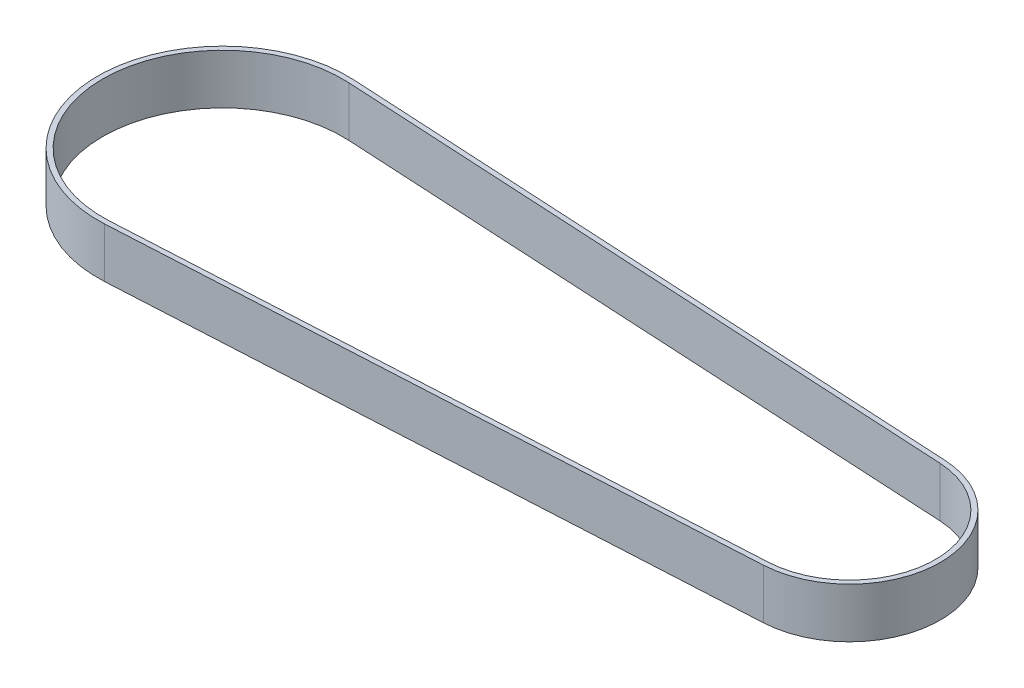
ISO-10303-21;
HEADER;
FILE_DESCRIPTION(('STEP AP214'),'2;1');
FILE_NAME('part.step','',(''),(''),'','','');
FILE_SCHEMA(('AUTOMOTIVE_DESIGN { 1 0 10303 214 1 1 1 1 }'));
ENDSEC;
DATA;
#1=APPLICATION_CONTEXT('core data for automotive mechanical design processes');
#2=APPLICATION_PROTOCOL_DEFINITION('international standard','automotive_design',2000,#1);
#3=PRODUCT_CONTEXT('',#1,'mechanical');
#4=PRODUCT('Part','Part','',(#3));
#5=PRODUCT_RELATED_PRODUCT_CATEGORY('part','',(#4));
#6=PRODUCT_DEFINITION_FORMATION('','',#4);
#7=PRODUCT_DEFINITION_CONTEXT('part definition',#1,'design');
#8=PRODUCT_DEFINITION('design','',#6,#7);
#9=PRODUCT_DEFINITION_SHAPE('','',#8);
#10=(LENGTH_UNIT() NAMED_UNIT(*) SI_UNIT(.MILLI.,.METRE.));
#11=(NAMED_UNIT(*) PLANE_ANGLE_UNIT() SI_UNIT($,.RADIAN.));
#12=(NAMED_UNIT(*) SI_UNIT($,.STERADIAN.) SOLID_ANGLE_UNIT());
#13=UNCERTAINTY_MEASURE_WITH_UNIT(LENGTH_MEASURE(1.E-05),#10,'distance_accuracy_value','');
#14=(GEOMETRIC_REPRESENTATION_CONTEXT(3) GLOBAL_UNCERTAINTY_ASSIGNED_CONTEXT((#13)) GLOBAL_UNIT_ASSIGNED_CONTEXT((#10,
#11,#12)) REPRESENTATION_CONTEXT('',''));
#15=CARTESIAN_POINT('',(0.,0.,0.));
#16=DIRECTION('',(0.,0.,1.));
#17=DIRECTION('',(1.,0.,0.));
#18=AXIS2_PLACEMENT_3D('',#15,#16,#17);
#19=CARTESIAN_POINT('',(0.,10.,0.));
#20=DIRECTION('',(0.,1.,0.));
#21=DIRECTION('',(0.,0.,1.));
#22=AXIS2_PLACEMENT_3D('',#19,#20,#21);
#23=PLANE('',#22);
#24=CARTESIAN_POINT('',(0.,10.,0.));
#25=DIRECTION('',(0.,1.,0.));
#26=DIRECTION('',(0.,0.,1.));
#27=AXIS2_PLACEMENT_3D('',#24,#25,#26);
#28=CIRCLE('',#27,25.);
#29=CARTESIAN_POINT('',(1.35458167330677,10.,-24.9632751955816));
#30=VERTEX_POINT('',#29);
#31=CARTESIAN_POINT('',(1.35458167330677,10.,24.9632751955816));
#32=VERTEX_POINT('',#31);
#33=EDGE_CURVE('E153',#30,#32,#28,.T.);
#34=ORIENTED_EDGE('',*,*,#33,.T.);
#35=DIRECTION('',(0.998531007823265,0.,-0.0541832669322709));
#36=VECTOR('',#35,1.);
#37=CARTESIAN_POINT('',(1.35458167330677,10.,24.9632751955816));
#38=LINE('',#37,#36);
#39=CARTESIAN_POINT('',(126.486135458167,10.,18.1732643423834));
#40=VERTEX_POINT('',#39);
#41=EDGE_CURVE('E157',#32,#40,#38,.T.);
#42=ORIENTED_EDGE('',*,*,#41,.T.);
#43=CARTESIAN_POINT('',(125.5,10.,0.));
#44=DIRECTION('',(0.,1.,0.));
#45=DIRECTION('',(0.,0.,1.));
#46=AXIS2_PLACEMENT_3D('',#43,#44,#45);
#47=CIRCLE('',#46,18.2);
#48=CARTESIAN_POINT('',(126.486135458167,10.,-18.1732643423834));
#49=VERTEX_POINT('',#48);
#50=EDGE_CURVE('E161',#40,#49,#47,.T.);
#51=ORIENTED_EDGE('',*,*,#50,.T.);
#52=DIRECTION('',(-0.998531007823265,0.,-0.0541832669322709));
#53=VECTOR('',#52,1.);
#54=CARTESIAN_POINT('',(1.35458167330677,10.,-24.9632751955816));
#55=LINE('',#54,#53);
#56=EDGE_CURVE('E164',#49,#30,#55,.T.);
#57=ORIENTED_EDGE('',*,*,#56,.T.);
#58=EDGE_LOOP('',(#34,#42,#51,#57));
#59=FACE_BOUND('',#58,.T.);
#60=DIRECTION('',(0.998531007823265,0.,-0.0541832669322709));
#61=VECTOR('',#60,1.);
#62=CARTESIAN_POINT('',(1.3003984063745,10.,23.9647441877584));
#63=LINE('',#62,#61);
#64=CARTESIAN_POINT('',(1.3003984063745,10.,23.9647441877584));
#65=VERTEX_POINT('',#64);
#66=CARTESIAN_POINT('',(126.431952191235,10.,17.1747333345602));
#67=VERTEX_POINT('',#66);
#68=EDGE_CURVE('E114',#65,#67,#63,.T.);
#69=ORIENTED_EDGE('',*,*,#68,.F.);
#70=CARTESIAN_POINT('',(0.,10.,0.));
#71=DIRECTION('',(0.,1.,0.));
#72=DIRECTION('',(0.,0.,1.));
#73=AXIS2_PLACEMENT_3D('',#70,#71,#72);
#74=CIRCLE('',#73,24.);
#75=CARTESIAN_POINT('',(1.3003984063745,10.,-23.9647441877584));
#76=VERTEX_POINT('',#75);
#77=EDGE_CURVE('E105',#76,#65,#74,.T.);
#78=ORIENTED_EDGE('',*,*,#77,.F.);
#79=DIRECTION('',(-0.998531007823265,0.,-0.0541832669322709));
#80=VECTOR('',#79,1.);
#81=CARTESIAN_POINT('',(1.3003984063745,10.,-23.9647441877584));
#82=LINE('',#81,#80);
#83=CARTESIAN_POINT('',(126.431952191235,10.,-17.1747333345602));
#84=VERTEX_POINT('',#83);
#85=EDGE_CURVE('E131',#84,#76,#82,.T.);
#86=ORIENTED_EDGE('',*,*,#85,.F.);
#87=CARTESIAN_POINT('',(125.5,10.,0.));
#88=DIRECTION('',(0.,1.,0.));
#89=DIRECTION('',(0.,0.,1.));
#90=AXIS2_PLACEMENT_3D('',#87,#88,#89);
#91=CIRCLE('',#90,17.2);
#92=EDGE_CURVE('E127',#67,#84,#91,.T.);
#93=ORIENTED_EDGE('',*,*,#92,.F.);
#94=EDGE_LOOP('',(#69,#78,#86,#93));
#95=FACE_BOUND('',#94,.T.);
#96=ADVANCED_FACE('F39',(#59,#95),#23,.T.);
#97=CARTESIAN_POINT('',(0.,0.,0.));
#98=DIRECTION('',(0.,1.,0.));
#99=DIRECTION('',(0.,0.,1.));
#100=AXIS2_PLACEMENT_3D('',#97,#98,#99);
#101=PLANE('',#100);
#102=CARTESIAN_POINT('',(0.,0.,0.));
#103=DIRECTION('',(0.,1.,0.));
#104=DIRECTION('',(0.,0.,1.));
#105=AXIS2_PLACEMENT_3D('',#102,#103,#104);
#106=CIRCLE('',#105,25.);
#107=CARTESIAN_POINT('',(1.35458167330677,0.,-24.9632751955816));
#108=VERTEX_POINT('',#107);
#109=CARTESIAN_POINT('',(1.35458167330677,0.,24.9632751955816));
#110=VERTEX_POINT('',#109);
#111=EDGE_CURVE('E123',#108,#110,#106,.T.);
#112=ORIENTED_EDGE('',*,*,#111,.F.);
#113=DIRECTION('',(-0.998531007823265,0.,-0.0541832669322709));
#114=VECTOR('',#113,1.);
#115=CARTESIAN_POINT('',(1.35458167330677,0.,-24.9632751955816));
#116=LINE('',#115,#114);
#117=CARTESIAN_POINT('',(126.486135458167,0.,-18.1732643423834));
#118=VERTEX_POINT('',#117);
#119=EDGE_CURVE('E158',#118,#108,#116,.T.);
#120=ORIENTED_EDGE('',*,*,#119,.F.);
#121=CARTESIAN_POINT('',(125.5,0.,0.));
#122=DIRECTION('',(0.,1.,0.));
#123=DIRECTION('',(0.,0.,1.));
#124=AXIS2_PLACEMENT_3D('',#121,#122,#123);
#125=CIRCLE('',#124,18.2);
#126=CARTESIAN_POINT('',(126.486135458167,0.,18.1732643423834));
#127=VERTEX_POINT('',#126);
#128=EDGE_CURVE('E174',#127,#118,#125,.T.);
#129=ORIENTED_EDGE('',*,*,#128,.F.);
#130=DIRECTION('',(0.998531007823265,0.,-0.0541832669322709));
#131=VECTOR('',#130,1.);
#132=CARTESIAN_POINT('',(1.35458167330677,0.,24.9632751955816));
#133=LINE('',#132,#131);
#134=EDGE_CURVE('E171',#110,#127,#133,.T.);
#135=ORIENTED_EDGE('',*,*,#134,.F.);
#136=EDGE_LOOP('',(#112,#120,#129,#135));
#137=FACE_BOUND('',#136,.T.);
#138=CARTESIAN_POINT('',(0.,0.,0.));
#139=DIRECTION('',(0.,1.,0.));
#140=DIRECTION('',(0.,0.,1.));
#141=AXIS2_PLACEMENT_3D('',#138,#139,#140);
#142=CIRCLE('',#141,24.);
#143=CARTESIAN_POINT('',(1.3003984063745,0.,-23.9647441877584));
#144=VERTEX_POINT('',#143);
#145=CARTESIAN_POINT('',(1.3003984063745,0.,23.9647441877584));
#146=VERTEX_POINT('',#145);
#147=EDGE_CURVE('E63',#144,#146,#142,.T.);
#148=ORIENTED_EDGE('',*,*,#147,.T.);
#149=DIRECTION('',(0.998531007823265,0.,-0.0541832669322709));
#150=VECTOR('',#149,1.);
#151=CARTESIAN_POINT('',(1.3003984063745,0.,23.9647441877584));
#152=LINE('',#151,#150);
#153=CARTESIAN_POINT('',(126.431952191235,0.,17.1747333345602));
#154=VERTEX_POINT('',#153);
#155=EDGE_CURVE('E121',#146,#154,#152,.T.);
#156=ORIENTED_EDGE('',*,*,#155,.T.);
#157=CARTESIAN_POINT('',(125.5,0.,0.));
#158=DIRECTION('',(0.,1.,0.));
#159=DIRECTION('',(0.,0.,1.));
#160=AXIS2_PLACEMENT_3D('',#157,#158,#159);
#161=CIRCLE('',#160,17.2);
#162=CARTESIAN_POINT('',(126.431952191235,0.,-17.1747333345602));
#163=VERTEX_POINT('',#162);
#164=EDGE_CURVE('E140',#154,#163,#161,.T.);
#165=ORIENTED_EDGE('',*,*,#164,.T.);
#166=DIRECTION('',(-0.998531007823265,0.,-0.0541832669322709));
#167=VECTOR('',#166,1.);
#168=CARTESIAN_POINT('',(1.3003984063745,0.,-23.9647441877584));
#169=LINE('',#168,#167);
#170=EDGE_CURVE('E115',#163,#144,#169,.T.);
#171=ORIENTED_EDGE('',*,*,#170,.T.);
#172=EDGE_LOOP('',(#148,#156,#165,#171));
#173=FACE_BOUND('',#172,.T.);
#174=ADVANCED_FACE('F197',(#137,#173),#101,.F.);
#175=CARTESIAN_POINT('',(0.,10.,0.));
#176=DIRECTION('',(0.,-1.,0.));
#177=DIRECTION('',(0.,0.,-1.));
#178=AXIS2_PLACEMENT_3D('',#175,#176,#177);
#179=CYLINDRICAL_SURFACE('',#178,25.);
#180=ORIENTED_EDGE('',*,*,#111,.T.);
#181=DIRECTION('',(0.,-1.,0.));
#182=VECTOR('',#181,1.);
#183=CARTESIAN_POINT('',(1.35458167330677,10.,24.9632751955816));
#184=LINE('',#183,#182);
#185=EDGE_CURVE('E11',#32,#110,#184,.T.);
#186=ORIENTED_EDGE('',*,*,#185,.F.);
#187=ORIENTED_EDGE('',*,*,#33,.F.);
#188=DIRECTION('',(0.,-1.,0.));
#189=VECTOR('',#188,1.);
#190=CARTESIAN_POINT('',(1.35458167330677,10.,-24.9632751955816));
#191=LINE('',#190,#189);
#192=EDGE_CURVE('E167',#30,#108,#191,.T.);
#193=ORIENTED_EDGE('',*,*,#192,.T.);
#194=EDGE_LOOP('',(#180,#186,#187,#193));
#195=FACE_BOUND('',#194,.T.);
#196=ADVANCED_FACE('F41',(#195),#179,.T.);
#197=CARTESIAN_POINT('',(1.35458167330677,10.,24.9632751955816));
#198=DIRECTION('',(-0.0541832669322709,0.,-0.998531007823266));
#199=DIRECTION('',(-0.998531007823266,0.,0.0541832669322709));
#200=AXIS2_PLACEMENT_3D('',#197,#198,#199);
#201=PLANE('',#200);
#202=ORIENTED_EDGE('',*,*,#134,.T.);
#203=DIRECTION('',(0.,-1.,0.));
#204=VECTOR('',#203,1.);
#205=CARTESIAN_POINT('',(126.486135458167,10.,18.1732643423834));
#206=LINE('',#205,#204);
#207=EDGE_CURVE('E48',#40,#127,#206,.T.);
#208=ORIENTED_EDGE('',*,*,#207,.F.);
#209=ORIENTED_EDGE('',*,*,#41,.F.);
#210=ORIENTED_EDGE('',*,*,#185,.T.);
#211=EDGE_LOOP('',(#202,#208,#209,#210));
#212=FACE_BOUND('',#211,.T.);
#213=ADVANCED_FACE('F207',(#212),#201,.F.);
#214=CARTESIAN_POINT('',(125.5,10.,0.));
#215=DIRECTION('',(0.,-1.,0.));
#216=DIRECTION('',(0.,0.,-1.));
#217=AXIS2_PLACEMENT_3D('',#214,#215,#216);
#218=CYLINDRICAL_SURFACE('',#217,18.2);
#219=ORIENTED_EDGE('',*,*,#128,.T.);
#220=DIRECTION('',(0.,-1.,0.));
#221=VECTOR('',#220,1.);
#222=CARTESIAN_POINT('',(126.486135458167,10.,-18.1732643423834));
#223=LINE('',#222,#221);
#224=EDGE_CURVE('E182',#49,#118,#223,.T.);
#225=ORIENTED_EDGE('',*,*,#224,.F.);
#226=ORIENTED_EDGE('',*,*,#50,.F.);
#227=ORIENTED_EDGE('',*,*,#207,.T.);
#228=EDGE_LOOP('',(#219,#225,#226,#227));
#229=FACE_BOUND('',#228,.T.);
#230=ADVANCED_FACE('F191',(#229),#218,.T.);
#231=CARTESIAN_POINT('',(1.35458167330677,10.,-24.9632751955816));
#232=DIRECTION('',(-0.0541832669322709,0.,0.998531007823266));
#233=DIRECTION('',(0.998531007823266,0.,0.0541832669322709));
#234=AXIS2_PLACEMENT_3D('',#231,#232,#233);
#235=PLANE('',#234);
#236=ORIENTED_EDGE('',*,*,#119,.T.);
#237=ORIENTED_EDGE('',*,*,#192,.F.);
#238=ORIENTED_EDGE('',*,*,#56,.F.);
#239=ORIENTED_EDGE('',*,*,#224,.T.);
#240=EDGE_LOOP('',(#236,#237,#238,#239));
#241=FACE_BOUND('',#240,.T.);
#242=ADVANCED_FACE('F201',(#241),#235,.F.);
#243=CARTESIAN_POINT('',(0.,10.,0.));
#244=DIRECTION('',(0.,-1.,0.));
#245=DIRECTION('',(0.,0.,-1.));
#246=AXIS2_PLACEMENT_3D('',#243,#244,#245);
#247=CYLINDRICAL_SURFACE('',#246,24.);
#248=ORIENTED_EDGE('',*,*,#147,.F.);
#249=DIRECTION('',(0.,-1.,0.));
#250=VECTOR('',#249,1.);
#251=CARTESIAN_POINT('',(1.3003984063745,10.,-23.9647441877584));
#252=LINE('',#251,#250);
#253=EDGE_CURVE('E109',#76,#144,#252,.T.);
#254=ORIENTED_EDGE('',*,*,#253,.F.);
#255=ORIENTED_EDGE('',*,*,#77,.T.);
#256=DIRECTION('',(0.,-1.,0.));
#257=VECTOR('',#256,1.);
#258=CARTESIAN_POINT('',(1.3003984063745,10.,23.9647441877584));
#259=LINE('',#258,#257);
#260=EDGE_CURVE('E108',#65,#146,#259,.T.);
#261=ORIENTED_EDGE('',*,*,#260,.T.);
#262=EDGE_LOOP('',(#248,#254,#255,#261));
#263=FACE_BOUND('',#262,.T.);
#264=ADVANCED_FACE('F107',(#263),#247,.F.);
#265=CARTESIAN_POINT('',(1.3003984063745,10.,23.9647441877584));
#266=DIRECTION('',(-0.054183266932271,0.,-0.998531007823266));
#267=DIRECTION('',(-0.998531007823266,0.,0.054183266932271));
#268=AXIS2_PLACEMENT_3D('',#265,#266,#267);
#269=PLANE('',#268);
#270=ORIENTED_EDGE('',*,*,#155,.F.);
#271=ORIENTED_EDGE('',*,*,#260,.F.);
#272=ORIENTED_EDGE('',*,*,#68,.T.);
#273=DIRECTION('',(0.,-1.,0.));
#274=VECTOR('',#273,1.);
#275=CARTESIAN_POINT('',(126.431952191235,10.,17.1747333345602));
#276=LINE('',#275,#274);
#277=EDGE_CURVE('E124',#67,#154,#276,.T.);
#278=ORIENTED_EDGE('',*,*,#277,.T.);
#279=EDGE_LOOP('',(#270,#271,#272,#278));
#280=FACE_BOUND('',#279,.T.);
#281=ADVANCED_FACE('F118',(#280),#269,.T.);
#282=CARTESIAN_POINT('',(125.5,10.,0.));
#283=DIRECTION('',(0.,-1.,0.));
#284=DIRECTION('',(0.,0.,-1.));
#285=AXIS2_PLACEMENT_3D('',#282,#283,#284);
#286=CYLINDRICAL_SURFACE('',#285,17.2);
#287=ORIENTED_EDGE('',*,*,#164,.F.);
#288=ORIENTED_EDGE('',*,*,#277,.F.);
#289=ORIENTED_EDGE('',*,*,#92,.T.);
#290=DIRECTION('',(0.,-1.,0.));
#291=VECTOR('',#290,1.);
#292=CARTESIAN_POINT('',(126.431952191235,10.,-17.1747333345602));
#293=LINE('',#292,#291);
#294=EDGE_CURVE('E55',#84,#163,#293,.T.);
#295=ORIENTED_EDGE('',*,*,#294,.T.);
#296=EDGE_LOOP('',(#287,#288,#289,#295));
#297=FACE_BOUND('',#296,.T.);
#298=ADVANCED_FACE('F230',(#297),#286,.F.);
#299=CARTESIAN_POINT('',(1.3003984063745,10.,-23.9647441877584));
#300=DIRECTION('',(-0.0541832669322709,0.,0.998531007823266));
#301=DIRECTION('',(0.998531007823266,0.,0.0541832669322709));
#302=AXIS2_PLACEMENT_3D('',#299,#300,#301);
#303=PLANE('',#302);
#304=ORIENTED_EDGE('',*,*,#170,.F.);
#305=ORIENTED_EDGE('',*,*,#294,.F.);
#306=ORIENTED_EDGE('',*,*,#85,.T.);
#307=ORIENTED_EDGE('',*,*,#253,.T.);
#308=EDGE_LOOP('',(#304,#305,#306,#307));
#309=FACE_BOUND('',#308,.T.);
#310=ADVANCED_FACE('F234',(#309),#303,.T.);
#311=CLOSED_SHELL('',(#96,#174,#196,#213,#230,#242,#264,#281,#298,#310));
#312=MANIFOLD_SOLID_BREP('B2',#311);
#313=ADVANCED_BREP_SHAPE_REPRESENTATION('',(#18,#312),#14);
#314=SHAPE_DEFINITION_REPRESENTATION(#9,#313);
ENDSEC;
END-ISO-10303-21;
